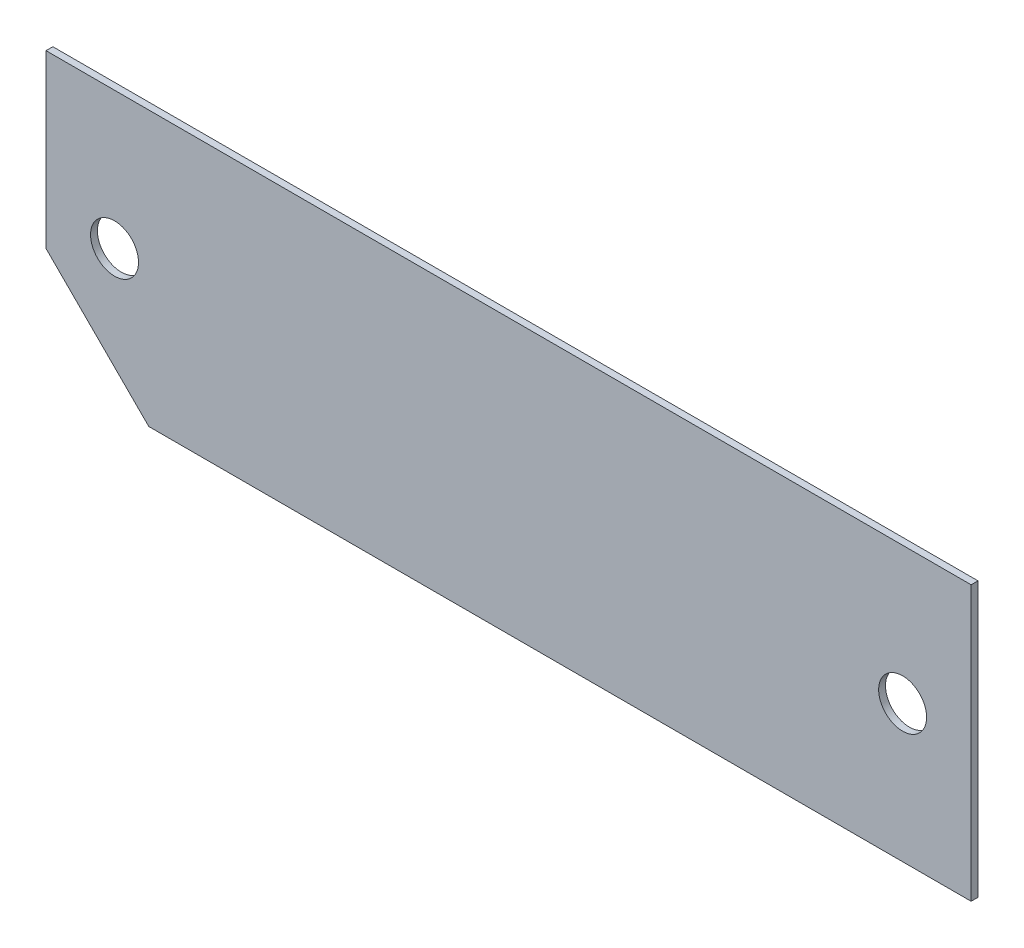
ISO-10303-21;
HEADER;
FILE_DESCRIPTION(('STEP AP214'),'2;1');
FILE_NAME('part.step','',(''),(''),'','','');
FILE_SCHEMA(('AUTOMOTIVE_DESIGN { 1 0 10303 214 1 1 1 1 }'));
ENDSEC;
DATA;
#1=APPLICATION_CONTEXT('core data for automotive mechanical design processes');
#2=APPLICATION_PROTOCOL_DEFINITION('international standard','automotive_design',2000,#1);
#3=PRODUCT_CONTEXT('',#1,'mechanical');
#4=PRODUCT('Part','Part','',(#3));
#5=PRODUCT_RELATED_PRODUCT_CATEGORY('part','',(#4));
#6=PRODUCT_DEFINITION_FORMATION('','',#4);
#7=PRODUCT_DEFINITION_CONTEXT('part definition',#1,'design');
#8=PRODUCT_DEFINITION('design','',#6,#7);
#9=PRODUCT_DEFINITION_SHAPE('','',#8);
#10=(LENGTH_UNIT() NAMED_UNIT(*) SI_UNIT(.MILLI.,.METRE.));
#11=(NAMED_UNIT(*) PLANE_ANGLE_UNIT() SI_UNIT($,.RADIAN.));
#12=(NAMED_UNIT(*) SI_UNIT($,.STERADIAN.) SOLID_ANGLE_UNIT());
#13=UNCERTAINTY_MEASURE_WITH_UNIT(LENGTH_MEASURE(1.E-05),#10,'distance_accuracy_value','');
#14=(GEOMETRIC_REPRESENTATION_CONTEXT(3) GLOBAL_UNCERTAINTY_ASSIGNED_CONTEXT((#13)) GLOBAL_UNIT_ASSIGNED_CONTEXT((#10,
#11,#12)) REPRESENTATION_CONTEXT('',''));
#15=CARTESIAN_POINT('',(0.,0.,0.));
#16=DIRECTION('',(0.,0.,1.));
#17=DIRECTION('',(1.,0.,0.));
#18=AXIS2_PLACEMENT_3D('',#15,#16,#17);
#19=CARTESIAN_POINT('',(-67.5,-20.,-1.));
#20=DIRECTION('',(-1.,0.,0.));
#21=DIRECTION('',(0.,0.,1.));
#22=AXIS2_PLACEMENT_3D('',#19,#20,#21);
#23=PLANE('',#22);
#24=DIRECTION('',(0.,-1.,0.));
#25=VECTOR('',#24,1.);
#26=CARTESIAN_POINT('',(-67.5,-20.,-1.));
#27=LINE('',#26,#25);
#28=CARTESIAN_POINT('',(-67.5,20.,-1.));
#29=VERTEX_POINT('',#28);
#30=CARTESIAN_POINT('',(-67.5,-5.00000000000002,-1.));
#31=VERTEX_POINT('',#30);
#32=EDGE_CURVE('E95',#29,#31,#27,.T.);
#33=ORIENTED_EDGE('',*,*,#32,.T.);
#34=DIRECTION('',(0.,0.,1.));
#35=VECTOR('',#34,1.);
#36=CARTESIAN_POINT('',(-67.5,-5.00000000000002,-1.));
#37=LINE('',#36,#35);
#38=CARTESIAN_POINT('',(-67.5,-5.00000000000002,0.));
#39=VERTEX_POINT('',#38);
#40=EDGE_CURVE('E124',#31,#39,#37,.T.);
#41=ORIENTED_EDGE('',*,*,#40,.T.);
#42=DIRECTION('',(0.,-1.,0.));
#43=VECTOR('',#42,1.);
#44=CARTESIAN_POINT('',(-67.5,-20.,0.));
#45=LINE('',#44,#43);
#46=CARTESIAN_POINT('',(-67.5,20.,0.));
#47=VERTEX_POINT('',#46);
#48=EDGE_CURVE('E113',#47,#39,#45,.T.);
#49=ORIENTED_EDGE('',*,*,#48,.F.);
#50=DIRECTION('',(0.,0.,1.));
#51=VECTOR('',#50,1.);
#52=CARTESIAN_POINT('',(-67.5,20.,-1.));
#53=LINE('',#52,#51);
#54=EDGE_CURVE('E122',#29,#47,#53,.T.);
#55=ORIENTED_EDGE('',*,*,#54,.F.);
#56=EDGE_LOOP('',(#33,#41,#49,#55));
#57=FACE_BOUND('',#56,.T.);
#58=ADVANCED_FACE('F43',(#57),#23,.T.);
#59=CARTESIAN_POINT('',(67.5,20.,-1.));
#60=DIRECTION('',(0.,1.,0.));
#61=DIRECTION('',(-1.,0.,0.));
#62=AXIS2_PLACEMENT_3D('',#59,#60,#61);
#63=PLANE('',#62);
#64=DIRECTION('',(-1.,0.,0.));
#65=VECTOR('',#64,1.);
#66=CARTESIAN_POINT('',(67.5,20.,0.));
#67=LINE('',#66,#65);
#68=CARTESIAN_POINT('',(67.5,20.,0.));
#69=VERTEX_POINT('',#68);
#70=EDGE_CURVE('E119',#69,#47,#67,.T.);
#71=ORIENTED_EDGE('',*,*,#70,.F.);
#72=DIRECTION('',(0.,0.,1.));
#73=VECTOR('',#72,1.);
#74=CARTESIAN_POINT('',(67.5,20.,-1.));
#75=LINE('',#74,#73);
#76=CARTESIAN_POINT('',(67.5,20.,-1.));
#77=VERTEX_POINT('',#76);
#78=EDGE_CURVE('E103',#77,#69,#75,.T.);
#79=ORIENTED_EDGE('',*,*,#78,.F.);
#80=DIRECTION('',(-1.,0.,0.));
#81=VECTOR('',#80,1.);
#82=CARTESIAN_POINT('',(67.5,20.,-1.));
#83=LINE('',#82,#81);
#84=EDGE_CURVE('E104',#77,#29,#83,.T.);
#85=ORIENTED_EDGE('',*,*,#84,.T.);
#86=ORIENTED_EDGE('',*,*,#54,.T.);
#87=EDGE_LOOP('',(#71,#79,#85,#86));
#88=FACE_BOUND('',#87,.T.);
#89=ADVANCED_FACE('F136',(#88),#63,.T.);
#90=CARTESIAN_POINT('',(67.5,-20.,-1.));
#91=DIRECTION('',(1.,0.,0.));
#92=DIRECTION('',(0.,0.,-1.));
#93=AXIS2_PLACEMENT_3D('',#90,#91,#92);
#94=PLANE('',#93);
#95=DIRECTION('',(0.,1.,0.));
#96=VECTOR('',#95,1.);
#97=CARTESIAN_POINT('',(67.5,-20.,0.));
#98=LINE('',#97,#96);
#99=CARTESIAN_POINT('',(67.5,-20.,0.));
#100=VERTEX_POINT('',#99);
#101=EDGE_CURVE('E102',#100,#69,#98,.T.);
#102=ORIENTED_EDGE('',*,*,#101,.F.);
#103=DIRECTION('',(0.,0.,1.));
#104=VECTOR('',#103,1.);
#105=CARTESIAN_POINT('',(67.5,-20.,-1.));
#106=LINE('',#105,#104);
#107=CARTESIAN_POINT('',(67.5,-20.,-1.));
#108=VERTEX_POINT('',#107);
#109=EDGE_CURVE('E89',#108,#100,#106,.T.);
#110=ORIENTED_EDGE('',*,*,#109,.F.);
#111=DIRECTION('',(0.,1.,0.));
#112=VECTOR('',#111,1.);
#113=CARTESIAN_POINT('',(67.5,-20.,-1.));
#114=LINE('',#113,#112);
#115=EDGE_CURVE('E94',#108,#77,#114,.T.);
#116=ORIENTED_EDGE('',*,*,#115,.T.);
#117=ORIENTED_EDGE('',*,*,#78,.T.);
#118=EDGE_LOOP('',(#102,#110,#116,#117));
#119=FACE_BOUND('',#118,.T.);
#120=ADVANCED_FACE('F99',(#119),#94,.T.);
#121=CARTESIAN_POINT('',(67.5,-20.,-1.));
#122=DIRECTION('',(0.,-1.,0.));
#123=DIRECTION('',(1.,0.,0.));
#124=AXIS2_PLACEMENT_3D('',#121,#122,#123);
#125=PLANE('',#124);
#126=DIRECTION('',(1.,0.,0.));
#127=VECTOR('',#126,1.);
#128=CARTESIAN_POINT('',(67.5,-20.,0.));
#129=LINE('',#128,#127);
#130=CARTESIAN_POINT('',(-52.4999999999999,-20.,0.));
#131=VERTEX_POINT('',#130);
#132=EDGE_CURVE('E115',#131,#100,#129,.T.);
#133=ORIENTED_EDGE('',*,*,#132,.F.);
#134=DIRECTION('',(0.,0.,-1.));
#135=VECTOR('',#134,1.);
#136=CARTESIAN_POINT('',(-52.4999999999999,-20.,-1.));
#137=LINE('',#136,#135);
#138=CARTESIAN_POINT('',(-52.4999999999999,-20.,-1.));
#139=VERTEX_POINT('',#138);
#140=EDGE_CURVE('E51',#131,#139,#137,.T.);
#141=ORIENTED_EDGE('',*,*,#140,.T.);
#142=DIRECTION('',(1.,0.,0.));
#143=VECTOR('',#142,1.);
#144=CARTESIAN_POINT('',(67.5,-20.,-1.));
#145=LINE('',#144,#143);
#146=EDGE_CURVE('E86',#139,#108,#145,.T.);
#147=ORIENTED_EDGE('',*,*,#146,.T.);
#148=ORIENTED_EDGE('',*,*,#109,.T.);
#149=EDGE_LOOP('',(#133,#141,#147,#148));
#150=FACE_BOUND('',#149,.T.);
#151=ADVANCED_FACE('F88',(#150),#125,.T.);
#152=CARTESIAN_POINT('',(0.,0.,-1.));
#153=DIRECTION('',(0.,0.,1.));
#154=DIRECTION('',(1.,0.,0.));
#155=AXIS2_PLACEMENT_3D('',#152,#153,#154);
#156=PLANE('',#155);
#157=CARTESIAN_POINT('',(57.5,0.,-1.));
#158=DIRECTION('',(0.,0.,1.));
#159=DIRECTION('',(-1.,0.,0.));
#160=AXIS2_PLACEMENT_3D('',#157,#158,#159);
#161=CIRCLE('',#160,3.5);
#162=CARTESIAN_POINT('',(54.,0.,-1.));
#163=VERTEX_POINT('',#162);
#164=EDGE_CURVE('E141',#163,#163,#161,.T.);
#165=ORIENTED_EDGE('',*,*,#164,.T.);
#166=EDGE_LOOP('',(#165));
#167=FACE_BOUND('',#166,.T.);
#168=CARTESIAN_POINT('',(-57.5,0.,-1.));
#169=DIRECTION('',(0.,0.,1.));
#170=DIRECTION('',(1.,0.,0.));
#171=AXIS2_PLACEMENT_3D('',#168,#169,#170);
#172=CIRCLE('',#171,3.5);
#173=CARTESIAN_POINT('',(-54.,0.,-1.));
#174=VERTEX_POINT('',#173);
#175=EDGE_CURVE('E116',#174,#174,#172,.T.);
#176=ORIENTED_EDGE('',*,*,#175,.T.);
#177=EDGE_LOOP('',(#176));
#178=FACE_BOUND('',#177,.T.);
#179=ORIENTED_EDGE('',*,*,#146,.F.);
#180=DIRECTION('',(0.707106781186549,-0.707106781186546,0.));
#181=VECTOR('',#180,1.);
#182=CARTESIAN_POINT('',(-67.5,-5.00000000000002,-1.));
#183=LINE('',#182,#181);
#184=EDGE_CURVE('E11',#139,#31,#183,.F.);
#185=ORIENTED_EDGE('',*,*,#184,.T.);
#186=ORIENTED_EDGE('',*,*,#32,.F.);
#187=ORIENTED_EDGE('',*,*,#84,.F.);
#188=ORIENTED_EDGE('',*,*,#115,.F.);
#189=EDGE_LOOP('',(#179,#185,#186,#187,#188));
#190=FACE_BOUND('',#189,.T.);
#191=ADVANCED_FACE('F106',(#167,#178,#190),#156,.F.);
#192=CARTESIAN_POINT('',(0.,0.,0.));
#193=DIRECTION('',(0.,0.,1.));
#194=DIRECTION('',(1.,0.,0.));
#195=AXIS2_PLACEMENT_3D('',#192,#193,#194);
#196=PLANE('',#195);
#197=CARTESIAN_POINT('',(57.5,0.,0.));
#198=DIRECTION('',(0.,0.,1.));
#199=DIRECTION('',(-1.,0.,0.));
#200=AXIS2_PLACEMENT_3D('',#197,#198,#199);
#201=CIRCLE('',#200,3.5);
#202=CARTESIAN_POINT('',(54.,0.,0.));
#203=VERTEX_POINT('',#202);
#204=EDGE_CURVE('E144',#203,#203,#201,.T.);
#205=ORIENTED_EDGE('',*,*,#204,.F.);
#206=EDGE_LOOP('',(#205));
#207=FACE_BOUND('',#206,.T.);
#208=CARTESIAN_POINT('',(-57.5,0.,0.));
#209=DIRECTION('',(0.,0.,1.));
#210=DIRECTION('',(1.,0.,0.));
#211=AXIS2_PLACEMENT_3D('',#208,#209,#210);
#212=CIRCLE('',#211,3.5);
#213=CARTESIAN_POINT('',(-54.,0.,0.));
#214=VERTEX_POINT('',#213);
#215=EDGE_CURVE('E138',#214,#214,#212,.T.);
#216=ORIENTED_EDGE('',*,*,#215,.F.);
#217=EDGE_LOOP('',(#216));
#218=FACE_BOUND('',#217,.T.);
#219=ORIENTED_EDGE('',*,*,#48,.T.);
#220=DIRECTION('',(-0.707106781186549,0.707106781186546,0.));
#221=VECTOR('',#220,1.);
#222=CARTESIAN_POINT('',(-36.2499999999999,-36.25,0.));
#223=LINE('',#222,#221);
#224=EDGE_CURVE('E65',#39,#131,#223,.F.);
#225=ORIENTED_EDGE('',*,*,#224,.T.);
#226=ORIENTED_EDGE('',*,*,#132,.T.);
#227=ORIENTED_EDGE('',*,*,#101,.T.);
#228=ORIENTED_EDGE('',*,*,#70,.T.);
#229=EDGE_LOOP('',(#219,#225,#226,#227,#228));
#230=FACE_BOUND('',#229,.T.);
#231=ADVANCED_FACE('F133',(#207,#218,#230),#196,.T.);
#232=CARTESIAN_POINT('',(-57.5,0.,-1.));
#233=DIRECTION('',(0.,0.,1.));
#234=DIRECTION('',(1.,0.,0.));
#235=AXIS2_PLACEMENT_3D('',#232,#233,#234);
#236=CYLINDRICAL_SURFACE('',#235,3.5);
#237=ORIENTED_EDGE('',*,*,#175,.F.);
#238=EDGE_LOOP('',(#237));
#239=FACE_BOUND('',#238,.T.);
#240=ORIENTED_EDGE('',*,*,#215,.T.);
#241=EDGE_LOOP('',(#240));
#242=FACE_BOUND('',#241,.T.);
#243=ADVANCED_FACE('F155',(#239,#242),#236,.F.);
#244=CARTESIAN_POINT('',(57.5,0.,-1.));
#245=DIRECTION('',(0.,0.,1.));
#246=DIRECTION('',(1.,0.,0.));
#247=AXIS2_PLACEMENT_3D('',#244,#245,#246);
#248=CYLINDRICAL_SURFACE('',#247,3.5);
#249=ORIENTED_EDGE('',*,*,#164,.F.);
#250=EDGE_LOOP('',(#249));
#251=FACE_BOUND('',#250,.T.);
#252=ORIENTED_EDGE('',*,*,#204,.T.);
#253=EDGE_LOOP('',(#252));
#254=FACE_BOUND('',#253,.T.);
#255=ADVANCED_FACE('F152',(#251,#254),#248,.F.);
#256=CARTESIAN_POINT('',(-67.5,-5.00000000000002,-1.));
#257=DIRECTION('',(0.707106781186546,0.707106781186549,0.));
#258=DIRECTION('',(0.,0.,1.));
#259=AXIS2_PLACEMENT_3D('',#256,#257,#258);
#260=PLANE('',#259);
#261=ORIENTED_EDGE('',*,*,#184,.F.);
#262=ORIENTED_EDGE('',*,*,#140,.F.);
#263=ORIENTED_EDGE('',*,*,#224,.F.);
#264=ORIENTED_EDGE('',*,*,#40,.F.);
#265=EDGE_LOOP('',(#261,#262,#263,#264));
#266=FACE_BOUND('',#265,.T.);
#267=ADVANCED_FACE('F45',(#266),#260,.F.);
#268=CLOSED_SHELL('',(#58,#89,#120,#151,#191,#231,#243,#255,#267));
#269=MANIFOLD_SOLID_BREP('B2',#268);
#270=ADVANCED_BREP_SHAPE_REPRESENTATION('',(#18,#269),#14);
#271=SHAPE_DEFINITION_REPRESENTATION(#9,#270);
ENDSEC;
END-ISO-10303-21;
